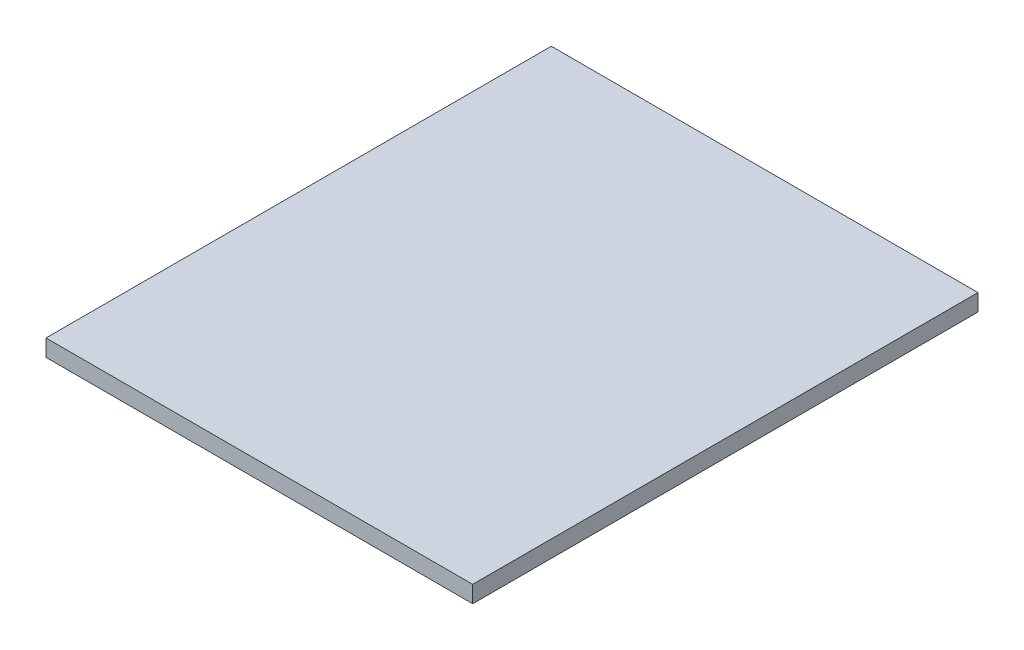
ISO-10303-21;
HEADER;
FILE_DESCRIPTION(('STEP AP214'),'2;1');
FILE_NAME('part.step','',(''),(''),'','','');
FILE_SCHEMA(('AUTOMOTIVE_DESIGN { 1 0 10303 214 1 1 1 1 }'));
ENDSEC;
DATA;
#1=APPLICATION_CONTEXT('core data for automotive mechanical design processes');
#2=APPLICATION_PROTOCOL_DEFINITION('international standard','automotive_design',2000,#1);
#3=PRODUCT_CONTEXT('',#1,'mechanical');
#4=PRODUCT('Part','Part','',(#3));
#5=PRODUCT_RELATED_PRODUCT_CATEGORY('part','',(#4));
#6=PRODUCT_DEFINITION_FORMATION('','',#4);
#7=PRODUCT_DEFINITION_CONTEXT('part definition',#1,'design');
#8=PRODUCT_DEFINITION('design','',#6,#7);
#9=PRODUCT_DEFINITION_SHAPE('','',#8);
#10=(LENGTH_UNIT() NAMED_UNIT(*) SI_UNIT(.MILLI.,.METRE.));
#11=(NAMED_UNIT(*) PLANE_ANGLE_UNIT() SI_UNIT($,.RADIAN.));
#12=(NAMED_UNIT(*) SI_UNIT($,.STERADIAN.) SOLID_ANGLE_UNIT());
#13=UNCERTAINTY_MEASURE_WITH_UNIT(LENGTH_MEASURE(1.E-05),#10,'distance_accuracy_value','');
#14=(GEOMETRIC_REPRESENTATION_CONTEXT(3) GLOBAL_UNCERTAINTY_ASSIGNED_CONTEXT((#13)) GLOBAL_UNIT_ASSIGNED_CONTEXT((#10,
#11,#12)) REPRESENTATION_CONTEXT('',''));
#15=CARTESIAN_POINT('',(0.,0.,0.));
#16=DIRECTION('',(0.,0.,1.));
#17=DIRECTION('',(1.,0.,0.));
#18=AXIS2_PLACEMENT_3D('',#15,#16,#17);
#19=CARTESIAN_POINT('',(19.,0.75,0.));
#20=DIRECTION('',(0.,0.,1.));
#21=DIRECTION('',(1.,0.,0.));
#22=AXIS2_PLACEMENT_3D('',#19,#20,#21);
#23=PLANE('',#22);
#24=DIRECTION('',(0.,-1.,0.));
#25=VECTOR('',#24,1.);
#26=CARTESIAN_POINT('',(0.,1.5,0.));
#27=LINE('',#26,#25);
#28=CARTESIAN_POINT('',(0.,1.5,0.));
#29=VERTEX_POINT('',#28);
#30=CARTESIAN_POINT('',(0.,0.,0.));
#31=VERTEX_POINT('',#30);
#32=EDGE_CURVE('E24',#29,#31,#27,.T.);
#33=ORIENTED_EDGE('',*,*,#32,.F.);
#34=DIRECTION('',(-1.,0.,0.));
#35=VECTOR('',#34,1.);
#36=CARTESIAN_POINT('',(38.,1.5,0.));
#37=LINE('',#36,#35);
#38=CARTESIAN_POINT('',(38.,1.5,0.));
#39=VERTEX_POINT('',#38);
#40=EDGE_CURVE('E87',#39,#29,#37,.T.);
#41=ORIENTED_EDGE('',*,*,#40,.F.);
#42=DIRECTION('',(0.,1.,0.));
#43=VECTOR('',#42,1.);
#44=CARTESIAN_POINT('',(38.,0.,0.));
#45=LINE('',#44,#43);
#46=CARTESIAN_POINT('',(38.,0.,0.));
#47=VERTEX_POINT('',#46);
#48=EDGE_CURVE('E67',#47,#39,#45,.T.);
#49=ORIENTED_EDGE('',*,*,#48,.F.);
#50=DIRECTION('',(1.,0.,0.));
#51=VECTOR('',#50,1.);
#52=CARTESIAN_POINT('',(0.,0.,0.));
#53=LINE('',#52,#51);
#54=EDGE_CURVE('E103',#31,#47,#53,.T.);
#55=ORIENTED_EDGE('',*,*,#54,.F.);
#56=EDGE_LOOP('',(#33,#41,#49,#55));
#57=FACE_BOUND('',#56,.T.);
#58=ADVANCED_FACE('F16',(#57),#23,.F.);
#59=CARTESIAN_POINT('',(19.,0.75,45.));
#60=DIRECTION('',(0.,0.,1.));
#61=DIRECTION('',(1.,0.,0.));
#62=AXIS2_PLACEMENT_3D('',#59,#60,#61);
#63=PLANE('',#62);
#64=DIRECTION('',(0.,-1.,0.));
#65=VECTOR('',#64,1.);
#66=CARTESIAN_POINT('',(0.,1.5,45.));
#67=LINE('',#66,#65);
#68=CARTESIAN_POINT('',(0.,1.5,45.));
#69=VERTEX_POINT('',#68);
#70=CARTESIAN_POINT('',(0.,0.,45.));
#71=VERTEX_POINT('',#70);
#72=EDGE_CURVE('E10',#69,#71,#67,.T.);
#73=ORIENTED_EDGE('',*,*,#72,.T.);
#74=DIRECTION('',(1.,0.,0.));
#75=VECTOR('',#74,1.);
#76=CARTESIAN_POINT('',(0.,0.,45.));
#77=LINE('',#76,#75);
#78=CARTESIAN_POINT('',(38.,0.,45.));
#79=VERTEX_POINT('',#78);
#80=EDGE_CURVE('E108',#71,#79,#77,.T.);
#81=ORIENTED_EDGE('',*,*,#80,.T.);
#82=DIRECTION('',(0.,1.,0.));
#83=VECTOR('',#82,1.);
#84=CARTESIAN_POINT('',(38.,0.,45.));
#85=LINE('',#84,#83);
#86=CARTESIAN_POINT('',(38.,1.5,45.));
#87=VERTEX_POINT('',#86);
#88=EDGE_CURVE('E81',#79,#87,#85,.T.);
#89=ORIENTED_EDGE('',*,*,#88,.T.);
#90=DIRECTION('',(-1.,0.,0.));
#91=VECTOR('',#90,1.);
#92=CARTESIAN_POINT('',(38.,1.5,45.));
#93=LINE('',#92,#91);
#94=EDGE_CURVE('E86',#87,#69,#93,.T.);
#95=ORIENTED_EDGE('',*,*,#94,.T.);
#96=EDGE_LOOP('',(#73,#81,#89,#95));
#97=FACE_BOUND('',#96,.T.);
#98=ADVANCED_FACE('F121',(#97),#63,.T.);
#99=CARTESIAN_POINT('',(0.,1.5,0.));
#100=DIRECTION('',(-1.,0.,0.));
#101=DIRECTION('',(0.,0.,1.));
#102=AXIS2_PLACEMENT_3D('',#99,#100,#101);
#103=PLANE('',#102);
#104=ORIENTED_EDGE('',*,*,#32,.T.);
#105=DIRECTION('',(0.,0.,1.));
#106=VECTOR('',#105,1.);
#107=CARTESIAN_POINT('',(0.,0.,0.));
#108=LINE('',#107,#106);
#109=EDGE_CURVE('E115',#31,#71,#108,.T.);
#110=ORIENTED_EDGE('',*,*,#109,.T.);
#111=ORIENTED_EDGE('',*,*,#72,.F.);
#112=DIRECTION('',(0.,0.,1.));
#113=VECTOR('',#112,1.);
#114=CARTESIAN_POINT('',(0.,1.5,0.));
#115=LINE('',#114,#113);
#116=EDGE_CURVE('E95',#29,#69,#115,.T.);
#117=ORIENTED_EDGE('',*,*,#116,.F.);
#118=EDGE_LOOP('',(#104,#110,#111,#117));
#119=FACE_BOUND('',#118,.T.);
#120=ADVANCED_FACE('F119',(#119),#103,.T.);
#121=CARTESIAN_POINT('',(0.,0.,0.));
#122=DIRECTION('',(0.,-1.,0.));
#123=DIRECTION('',(0.,0.,-1.));
#124=AXIS2_PLACEMENT_3D('',#121,#122,#123);
#125=PLANE('',#124);
#126=ORIENTED_EDGE('',*,*,#54,.T.);
#127=DIRECTION('',(0.,0.,1.));
#128=VECTOR('',#127,1.);
#129=CARTESIAN_POINT('',(38.,0.,0.));
#130=LINE('',#129,#128);
#131=EDGE_CURVE('E76',#47,#79,#130,.T.);
#132=ORIENTED_EDGE('',*,*,#131,.T.);
#133=ORIENTED_EDGE('',*,*,#80,.F.);
#134=ORIENTED_EDGE('',*,*,#109,.F.);
#135=EDGE_LOOP('',(#126,#132,#133,#134));
#136=FACE_BOUND('',#135,.T.);
#137=ADVANCED_FACE('F120',(#136),#125,.T.);
#138=CARTESIAN_POINT('',(38.,0.,0.));
#139=DIRECTION('',(1.,0.,0.));
#140=DIRECTION('',(0.,1.,0.));
#141=AXIS2_PLACEMENT_3D('',#138,#139,#140);
#142=PLANE('',#141);
#143=ORIENTED_EDGE('',*,*,#48,.T.);
#144=DIRECTION('',(0.,0.,1.));
#145=VECTOR('',#144,1.);
#146=CARTESIAN_POINT('',(38.,1.5,0.));
#147=LINE('',#146,#145);
#148=EDGE_CURVE('E73',#39,#87,#147,.T.);
#149=ORIENTED_EDGE('',*,*,#148,.T.);
#150=ORIENTED_EDGE('',*,*,#88,.F.);
#151=ORIENTED_EDGE('',*,*,#131,.F.);
#152=EDGE_LOOP('',(#143,#149,#150,#151));
#153=FACE_BOUND('',#152,.T.);
#154=ADVANCED_FACE('F75',(#153),#142,.T.);
#155=CARTESIAN_POINT('',(38.,1.5,0.));
#156=DIRECTION('',(0.,1.,0.));
#157=DIRECTION('',(1.,0.,0.));
#158=AXIS2_PLACEMENT_3D('',#155,#156,#157);
#159=PLANE('',#158);
#160=ORIENTED_EDGE('',*,*,#40,.T.);
#161=ORIENTED_EDGE('',*,*,#116,.T.);
#162=ORIENTED_EDGE('',*,*,#94,.F.);
#163=ORIENTED_EDGE('',*,*,#148,.F.);
#164=EDGE_LOOP('',(#160,#161,#162,#163));
#165=FACE_BOUND('',#164,.T.);
#166=ADVANCED_FACE('F84',(#165),#159,.T.);
#167=CLOSED_SHELL('',(#58,#98,#120,#137,#154,#166));
#168=MANIFOLD_SOLID_BREP('B1',#167);
#169=ADVANCED_BREP_SHAPE_REPRESENTATION('',(#18,#168),#14);
#170=SHAPE_DEFINITION_REPRESENTATION(#9,#169);
ENDSEC;
END-ISO-10303-21;
